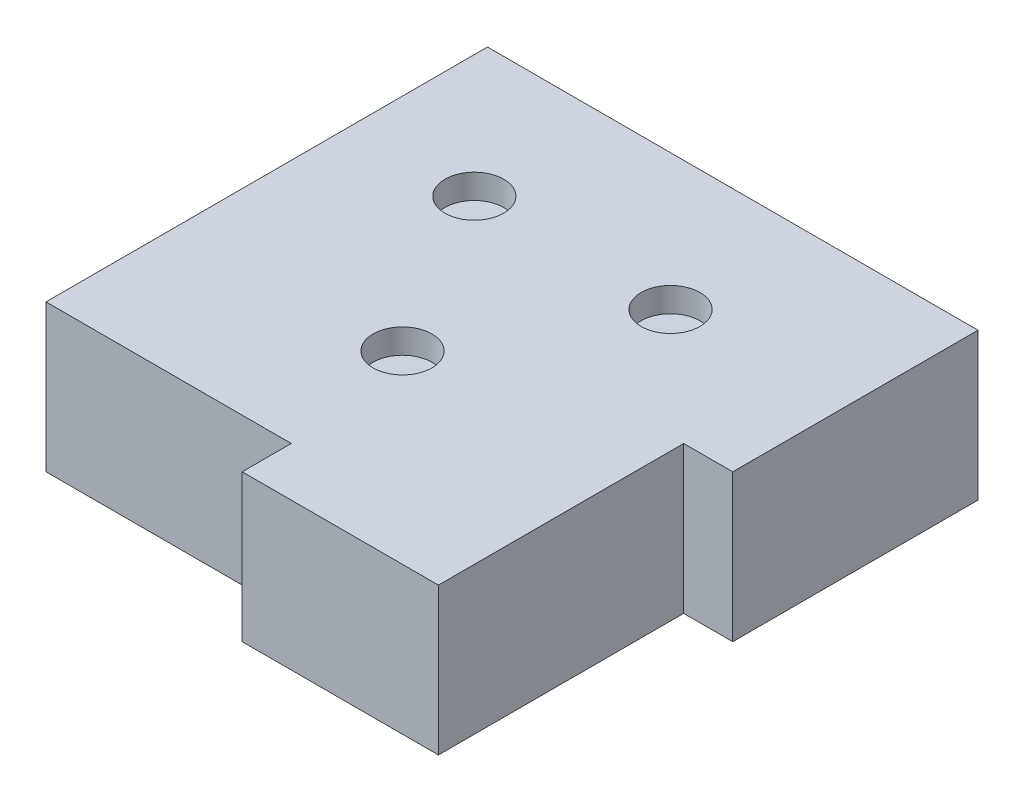
ISO-10303-21;
HEADER;
FILE_DESCRIPTION(('STEP AP214'),'2;1');
FILE_NAME('part.step','',(''),(''),'','','');
FILE_SCHEMA(('AUTOMOTIVE_DESIGN { 1 0 10303 214 1 1 1 1 }'));
ENDSEC;
DATA;
#1=APPLICATION_CONTEXT('core data for automotive mechanical design processes');
#2=APPLICATION_PROTOCOL_DEFINITION('international standard','automotive_design',2000,#1);
#3=PRODUCT_CONTEXT('',#1,'mechanical');
#4=PRODUCT('Part','Part','',(#3));
#5=PRODUCT_RELATED_PRODUCT_CATEGORY('part','',(#4));
#6=PRODUCT_DEFINITION_FORMATION('','',#4);
#7=PRODUCT_DEFINITION_CONTEXT('part definition',#1,'design');
#8=PRODUCT_DEFINITION('design','',#6,#7);
#9=PRODUCT_DEFINITION_SHAPE('','',#8);
#10=(LENGTH_UNIT() NAMED_UNIT(*) SI_UNIT(.MILLI.,.METRE.));
#11=(NAMED_UNIT(*) PLANE_ANGLE_UNIT() SI_UNIT($,.RADIAN.));
#12=(NAMED_UNIT(*) SI_UNIT($,.STERADIAN.) SOLID_ANGLE_UNIT());
#13=UNCERTAINTY_MEASURE_WITH_UNIT(LENGTH_MEASURE(1.E-05),#10,'distance_accuracy_value','');
#14=(GEOMETRIC_REPRESENTATION_CONTEXT(3) GLOBAL_UNCERTAINTY_ASSIGNED_CONTEXT((#13)) GLOBAL_UNIT_ASSIGNED_CONTEXT((#10,
#11,#12)) REPRESENTATION_CONTEXT('',''));
#15=CARTESIAN_POINT('',(0.,0.,0.));
#16=DIRECTION('',(0.,0.,1.));
#17=DIRECTION('',(1.,0.,0.));
#18=AXIS2_PLACEMENT_3D('',#15,#16,#17);
#19=CARTESIAN_POINT('',(100.,30.,-50.));
#20=DIRECTION('',(-1.,0.,0.));
#21=DIRECTION('',(0.,0.,1.));
#22=AXIS2_PLACEMENT_3D('',#19,#20,#21);
#23=PLANE('',#22);
#24=DIRECTION('',(0.,0.,-1.));
#25=VECTOR('',#24,1.);
#26=CARTESIAN_POINT('',(100.,0.,-50.));
#27=LINE('',#26,#25);
#28=CARTESIAN_POINT('',(100.,0.,-50.));
#29=VERTEX_POINT('',#28);
#30=CARTESIAN_POINT('',(100.,0.,-100.));
#31=VERTEX_POINT('',#30);
#32=EDGE_CURVE('E144',#29,#31,#27,.T.);
#33=ORIENTED_EDGE('',*,*,#32,.T.);
#34=DIRECTION('',(0.,-1.,0.));
#35=VECTOR('',#34,1.);
#36=CARTESIAN_POINT('',(100.,30.,-100.));
#37=LINE('',#36,#35);
#38=CARTESIAN_POINT('',(100.,30.,-100.));
#39=VERTEX_POINT('',#38);
#40=EDGE_CURVE('E11',#39,#31,#37,.T.);
#41=ORIENTED_EDGE('',*,*,#40,.F.);
#42=DIRECTION('',(0.,0.,-1.));
#43=VECTOR('',#42,1.);
#44=CARTESIAN_POINT('',(100.,30.,-50.));
#45=LINE('',#44,#43);
#46=CARTESIAN_POINT('',(100.,30.,-50.));
#47=VERTEX_POINT('',#46);
#48=EDGE_CURVE('E167',#47,#39,#45,.T.);
#49=ORIENTED_EDGE('',*,*,#48,.F.);
#50=DIRECTION('',(0.,-1.,0.));
#51=VECTOR('',#50,1.);
#52=CARTESIAN_POINT('',(100.,30.,-50.));
#53=LINE('',#52,#51);
#54=EDGE_CURVE('E140',#47,#29,#53,.T.);
#55=ORIENTED_EDGE('',*,*,#54,.T.);
#56=EDGE_LOOP('',(#33,#41,#49,#55));
#57=FACE_BOUND('',#56,.T.);
#58=ADVANCED_FACE('F43',(#57),#23,.F.);
#59=CARTESIAN_POINT('',(0.,30.,-100.));
#60=DIRECTION('',(0.,0.,1.));
#61=DIRECTION('',(1.,0.,0.));
#62=AXIS2_PLACEMENT_3D('',#59,#60,#61);
#63=PLANE('',#62);
#64=DIRECTION('',(-1.,0.,0.));
#65=VECTOR('',#64,1.);
#66=CARTESIAN_POINT('',(0.,0.,-100.));
#67=LINE('',#66,#65);
#68=CARTESIAN_POINT('',(0.,0.,-100.));
#69=VERTEX_POINT('',#68);
#70=EDGE_CURVE('E148',#31,#69,#67,.T.);
#71=ORIENTED_EDGE('',*,*,#70,.T.);
#72=DIRECTION('',(0.,-1.,0.));
#73=VECTOR('',#72,1.);
#74=CARTESIAN_POINT('',(0.,30.,-100.));
#75=LINE('',#74,#73);
#76=CARTESIAN_POINT('',(0.,30.,-100.));
#77=VERTEX_POINT('',#76);
#78=EDGE_CURVE('E52',#77,#69,#75,.T.);
#79=ORIENTED_EDGE('',*,*,#78,.F.);
#80=DIRECTION('',(-1.,0.,0.));
#81=VECTOR('',#80,1.);
#82=CARTESIAN_POINT('',(0.,30.,-100.));
#83=LINE('',#82,#81);
#84=EDGE_CURVE('E103',#39,#77,#83,.T.);
#85=ORIENTED_EDGE('',*,*,#84,.F.);
#86=ORIENTED_EDGE('',*,*,#40,.T.);
#87=EDGE_LOOP('',(#71,#79,#85,#86));
#88=FACE_BOUND('',#87,.T.);
#89=ADVANCED_FACE('F268',(#88),#63,.F.);
#90=CARTESIAN_POINT('',(0.,30.,-10.));
#91=DIRECTION('',(1.,0.,0.));
#92=DIRECTION('',(0.,0.,-1.));
#93=AXIS2_PLACEMENT_3D('',#90,#91,#92);
#94=PLANE('',#93);
#95=DIRECTION('',(0.,0.,1.));
#96=VECTOR('',#95,1.);
#97=CARTESIAN_POINT('',(0.,0.,-10.));
#98=LINE('',#97,#96);
#99=CARTESIAN_POINT('',(0.,0.,-10.));
#100=VERTEX_POINT('',#99);
#101=EDGE_CURVE('E152',#69,#100,#98,.T.);
#102=ORIENTED_EDGE('',*,*,#101,.T.);
#103=DIRECTION('',(0.,-1.,0.));
#104=VECTOR('',#103,1.);
#105=CARTESIAN_POINT('',(0.,30.,-10.));
#106=LINE('',#105,#104);
#107=CARTESIAN_POINT('',(0.,30.,-10.));
#108=VERTEX_POINT('',#107);
#109=EDGE_CURVE('E178',#108,#100,#106,.T.);
#110=ORIENTED_EDGE('',*,*,#109,.F.);
#111=DIRECTION('',(0.,0.,1.));
#112=VECTOR('',#111,1.);
#113=CARTESIAN_POINT('',(0.,30.,-10.));
#114=LINE('',#113,#112);
#115=EDGE_CURVE('E188',#77,#108,#114,.T.);
#116=ORIENTED_EDGE('',*,*,#115,.F.);
#117=ORIENTED_EDGE('',*,*,#78,.T.);
#118=EDGE_LOOP('',(#102,#110,#116,#117));
#119=FACE_BOUND('',#118,.T.);
#120=ADVANCED_FACE('F186',(#119),#94,.F.);
#121=CARTESIAN_POINT('',(0.,30.,-10.));
#122=DIRECTION('',(0.,0.,-1.));
#123=DIRECTION('',(-1.,0.,0.));
#124=AXIS2_PLACEMENT_3D('',#121,#122,#123);
#125=PLANE('',#124);
#126=DIRECTION('',(1.,0.,0.));
#127=VECTOR('',#126,1.);
#128=CARTESIAN_POINT('',(0.,0.,-10.));
#129=LINE('',#128,#127);
#130=CARTESIAN_POINT('',(50.,0.,-10.));
#131=VERTEX_POINT('',#130);
#132=EDGE_CURVE('E155',#100,#131,#129,.T.);
#133=ORIENTED_EDGE('',*,*,#132,.T.);
#134=DIRECTION('',(0.,-1.,0.));
#135=VECTOR('',#134,1.);
#136=CARTESIAN_POINT('',(50.,30.,-10.));
#137=LINE('',#136,#135);
#138=CARTESIAN_POINT('',(50.,30.,-10.));
#139=VERTEX_POINT('',#138);
#140=EDGE_CURVE('E174',#139,#131,#137,.T.);
#141=ORIENTED_EDGE('',*,*,#140,.F.);
#142=DIRECTION('',(1.,0.,0.));
#143=VECTOR('',#142,1.);
#144=CARTESIAN_POINT('',(0.,30.,-10.));
#145=LINE('',#144,#143);
#146=EDGE_CURVE('E201',#108,#139,#145,.T.);
#147=ORIENTED_EDGE('',*,*,#146,.F.);
#148=ORIENTED_EDGE('',*,*,#109,.T.);
#149=EDGE_LOOP('',(#133,#141,#147,#148));
#150=FACE_BOUND('',#149,.T.);
#151=ADVANCED_FACE('F196',(#150),#125,.F.);
#152=CARTESIAN_POINT('',(50.,30.,-10.));
#153=DIRECTION('',(1.,0.,0.));
#154=DIRECTION('',(0.,0.,-1.));
#155=AXIS2_PLACEMENT_3D('',#152,#153,#154);
#156=PLANE('',#155);
#157=DIRECTION('',(0.,0.,1.));
#158=VECTOR('',#157,1.);
#159=CARTESIAN_POINT('',(50.,0.,-10.));
#160=LINE('',#159,#158);
#161=CARTESIAN_POINT('',(50.,0.,0.));
#162=VERTEX_POINT('',#161);
#163=EDGE_CURVE('E158',#131,#162,#160,.T.);
#164=ORIENTED_EDGE('',*,*,#163,.T.);
#165=DIRECTION('',(0.,-1.,0.));
#166=VECTOR('',#165,1.);
#167=CARTESIAN_POINT('',(50.,30.,0.));
#168=LINE('',#167,#166);
#169=CARTESIAN_POINT('',(50.,30.,0.));
#170=VERTEX_POINT('',#169);
#171=EDGE_CURVE('E133',#170,#162,#168,.T.);
#172=ORIENTED_EDGE('',*,*,#171,.F.);
#173=DIRECTION('',(0.,0.,1.));
#174=VECTOR('',#173,1.);
#175=CARTESIAN_POINT('',(50.,30.,-10.));
#176=LINE('',#175,#174);
#177=EDGE_CURVE('E122',#139,#170,#176,.T.);
#178=ORIENTED_EDGE('',*,*,#177,.F.);
#179=ORIENTED_EDGE('',*,*,#140,.T.);
#180=EDGE_LOOP('',(#164,#172,#178,#179));
#181=FACE_BOUND('',#180,.T.);
#182=ADVANCED_FACE('F199',(#181),#156,.F.);
#183=CARTESIAN_POINT('',(50.,30.,0.));
#184=DIRECTION('',(0.,0.,-1.));
#185=DIRECTION('',(-1.,0.,0.));
#186=AXIS2_PLACEMENT_3D('',#183,#184,#185);
#187=PLANE('',#186);
#188=DIRECTION('',(1.,0.,0.));
#189=VECTOR('',#188,1.);
#190=CARTESIAN_POINT('',(50.,0.,0.));
#191=LINE('',#190,#189);
#192=CARTESIAN_POINT('',(90.,0.,0.));
#193=VERTEX_POINT('',#192);
#194=EDGE_CURVE('E131',#162,#193,#191,.T.);
#195=ORIENTED_EDGE('',*,*,#194,.T.);
#196=DIRECTION('',(0.,-1.,0.));
#197=VECTOR('',#196,1.);
#198=CARTESIAN_POINT('',(90.,30.,0.));
#199=LINE('',#198,#197);
#200=CARTESIAN_POINT('',(90.,30.,0.));
#201=VERTEX_POINT('',#200);
#202=EDGE_CURVE('E128',#201,#193,#199,.T.);
#203=ORIENTED_EDGE('',*,*,#202,.F.);
#204=DIRECTION('',(1.,0.,0.));
#205=VECTOR('',#204,1.);
#206=CARTESIAN_POINT('',(50.,30.,0.));
#207=LINE('',#206,#205);
#208=EDGE_CURVE('E116',#170,#201,#207,.T.);
#209=ORIENTED_EDGE('',*,*,#208,.F.);
#210=ORIENTED_EDGE('',*,*,#171,.T.);
#211=EDGE_LOOP('',(#195,#203,#209,#210));
#212=FACE_BOUND('',#211,.T.);
#213=ADVANCED_FACE('F129',(#212),#187,.F.);
#214=CARTESIAN_POINT('',(90.,30.,0.));
#215=DIRECTION('',(-1.,0.,0.));
#216=DIRECTION('',(0.,0.,1.));
#217=AXIS2_PLACEMENT_3D('',#214,#215,#216);
#218=PLANE('',#217);
#219=DIRECTION('',(0.,0.,-1.));
#220=VECTOR('',#219,1.);
#221=CARTESIAN_POINT('',(90.,0.,0.));
#222=LINE('',#221,#220);
#223=CARTESIAN_POINT('',(90.,0.,-50.));
#224=VERTEX_POINT('',#223);
#225=EDGE_CURVE('E89',#193,#224,#222,.T.);
#226=ORIENTED_EDGE('',*,*,#225,.T.);
#227=DIRECTION('',(0.,-1.,0.));
#228=VECTOR('',#227,1.);
#229=CARTESIAN_POINT('',(90.,30.,-50.));
#230=LINE('',#229,#228);
#231=CARTESIAN_POINT('',(90.,30.,-50.));
#232=VERTEX_POINT('',#231);
#233=EDGE_CURVE('E134',#232,#224,#230,.T.);
#234=ORIENTED_EDGE('',*,*,#233,.F.);
#235=DIRECTION('',(0.,0.,-1.));
#236=VECTOR('',#235,1.);
#237=CARTESIAN_POINT('',(90.,30.,0.));
#238=LINE('',#237,#236);
#239=EDGE_CURVE('E120',#201,#232,#238,.T.);
#240=ORIENTED_EDGE('',*,*,#239,.F.);
#241=ORIENTED_EDGE('',*,*,#202,.T.);
#242=EDGE_LOOP('',(#226,#234,#240,#241));
#243=FACE_BOUND('',#242,.T.);
#244=ADVANCED_FACE('F136',(#243),#218,.F.);
#245=CARTESIAN_POINT('',(90.,30.,-50.));
#246=DIRECTION('',(0.,0.,-1.));
#247=DIRECTION('',(-1.,0.,0.));
#248=AXIS2_PLACEMENT_3D('',#245,#246,#247);
#249=PLANE('',#248);
#250=DIRECTION('',(1.,0.,0.));
#251=VECTOR('',#250,1.);
#252=CARTESIAN_POINT('',(90.,0.,-50.));
#253=LINE('',#252,#251);
#254=EDGE_CURVE('E95',#224,#29,#253,.T.);
#255=ORIENTED_EDGE('',*,*,#254,.T.);
#256=ORIENTED_EDGE('',*,*,#54,.F.);
#257=DIRECTION('',(1.,0.,0.));
#258=VECTOR('',#257,1.);
#259=CARTESIAN_POINT('',(90.,30.,-50.));
#260=LINE('',#259,#258);
#261=EDGE_CURVE('E60',#232,#47,#260,.T.);
#262=ORIENTED_EDGE('',*,*,#261,.F.);
#263=ORIENTED_EDGE('',*,*,#233,.T.);
#264=EDGE_LOOP('',(#255,#256,#262,#263));
#265=FACE_BOUND('',#264,.T.);
#266=ADVANCED_FACE('F246',(#265),#249,.F.);
#267=CARTESIAN_POINT('',(0.,30.,0.));
#268=DIRECTION('',(0.,-1.,0.));
#269=DIRECTION('',(0.,0.,-1.));
#270=AXIS2_PLACEMENT_3D('',#267,#268,#269);
#271=PLANE('',#270);
#272=CARTESIAN_POINT('',(25.,30.,-72.32));
#273=DIRECTION('',(0.,1.,0.));
#274=DIRECTION('',(0.,0.,1.));
#275=AXIS2_PLACEMENT_3D('',#272,#273,#274);
#276=CIRCLE('',#275,6.);
#277=CARTESIAN_POINT('',(25.,30.,-66.32));
#278=VERTEX_POINT('',#277);
#279=EDGE_CURVE('E227',#278,#278,#276,.T.);
#280=ORIENTED_EDGE('',*,*,#279,.F.);
#281=EDGE_LOOP('',(#280));
#282=FACE_BOUND('',#281,.T.);
#283=CARTESIAN_POINT('',(65.,30.,-72.32));
#284=DIRECTION('',(0.,1.,0.));
#285=DIRECTION('',(0.,0.,1.));
#286=AXIS2_PLACEMENT_3D('',#283,#284,#285);
#287=CIRCLE('',#286,6.);
#288=CARTESIAN_POINT('',(65.,30.,-66.32));
#289=VERTEX_POINT('',#288);
#290=EDGE_CURVE('E223',#289,#289,#287,.T.);
#291=ORIENTED_EDGE('',*,*,#290,.F.);
#292=EDGE_LOOP('',(#291));
#293=FACE_BOUND('',#292,.T.);
#294=CARTESIAN_POINT('',(45.,30.,-37.68));
#295=DIRECTION('',(0.,1.,0.));
#296=DIRECTION('',(0.,0.,1.));
#297=AXIS2_PLACEMENT_3D('',#294,#295,#296);
#298=CIRCLE('',#297,6.);
#299=CARTESIAN_POINT('',(45.,30.,-31.68));
#300=VERTEX_POINT('',#299);
#301=EDGE_CURVE('E215',#300,#300,#298,.T.);
#302=ORIENTED_EDGE('',*,*,#301,.F.);
#303=EDGE_LOOP('',(#302));
#304=FACE_BOUND('',#303,.T.);
#305=ORIENTED_EDGE('',*,*,#48,.T.);
#306=ORIENTED_EDGE('',*,*,#84,.T.);
#307=ORIENTED_EDGE('',*,*,#115,.T.);
#308=ORIENTED_EDGE('',*,*,#146,.T.);
#309=ORIENTED_EDGE('',*,*,#177,.T.);
#310=ORIENTED_EDGE('',*,*,#208,.T.);
#311=ORIENTED_EDGE('',*,*,#239,.T.);
#312=ORIENTED_EDGE('',*,*,#261,.T.);
#313=EDGE_LOOP('',(#305,#306,#307,#308,#309,#310,#311,#312));
#314=FACE_BOUND('',#313,.T.);
#315=ADVANCED_FACE('F118',(#282,#293,#304,#314),#271,.F.);
#316=CARTESIAN_POINT('',(0.,0.,0.));
#317=DIRECTION('',(0.,-1.,0.));
#318=DIRECTION('',(0.,0.,-1.));
#319=AXIS2_PLACEMENT_3D('',#316,#317,#318);
#320=PLANE('',#319);
#321=ORIENTED_EDGE('',*,*,#32,.F.);
#322=ORIENTED_EDGE('',*,*,#254,.F.);
#323=ORIENTED_EDGE('',*,*,#225,.F.);
#324=ORIENTED_EDGE('',*,*,#194,.F.);
#325=ORIENTED_EDGE('',*,*,#163,.F.);
#326=ORIENTED_EDGE('',*,*,#132,.F.);
#327=ORIENTED_EDGE('',*,*,#101,.F.);
#328=ORIENTED_EDGE('',*,*,#70,.F.);
#329=EDGE_LOOP('',(#321,#322,#323,#324,#325,#326,#327,#328));
#330=FACE_BOUND('',#329,.T.);
#331=ADVANCED_FACE('F192',(#330),#320,.T.);
#332=CARTESIAN_POINT('',(45.,25.,-37.68));
#333=DIRECTION('',(0.,1.,0.));
#334=DIRECTION('',(0.,0.,1.));
#335=AXIS2_PLACEMENT_3D('',#332,#333,#334);
#336=CYLINDRICAL_SURFACE('',#335,6.);
#337=CARTESIAN_POINT('',(45.,25.,-37.68));
#338=DIRECTION('',(0.,1.,0.));
#339=DIRECTION('',(0.,0.,1.));
#340=AXIS2_PLACEMENT_3D('',#337,#338,#339);
#341=CIRCLE('',#340,6.);
#342=CARTESIAN_POINT('',(45.,25.,-31.68));
#343=VERTEX_POINT('',#342);
#344=EDGE_CURVE('E211',#343,#343,#341,.T.);
#345=ORIENTED_EDGE('',*,*,#344,.F.);
#346=EDGE_LOOP('',(#345));
#347=FACE_BOUND('',#346,.T.);
#348=ORIENTED_EDGE('',*,*,#301,.T.);
#349=EDGE_LOOP('',(#348));
#350=FACE_BOUND('',#349,.T.);
#351=ADVANCED_FACE('F252',(#347,#350),#336,.F.);
#352=CARTESIAN_POINT('',(45.,25.,-37.68));
#353=DIRECTION('',(0.,1.,0.));
#354=DIRECTION('',(0.,0.,1.));
#355=AXIS2_PLACEMENT_3D('',#352,#353,#354);
#356=PLANE('',#355);
#357=ORIENTED_EDGE('',*,*,#344,.T.);
#358=EDGE_LOOP('',(#357));
#359=FACE_BOUND('',#358,.T.);
#360=ADVANCED_FACE('F254',(#359),#356,.T.);
#361=CARTESIAN_POINT('',(65.,25.,-72.32));
#362=DIRECTION('',(0.,1.,0.));
#363=DIRECTION('',(0.,0.,1.));
#364=AXIS2_PLACEMENT_3D('',#361,#362,#363);
#365=CYLINDRICAL_SURFACE('',#364,6.);
#366=CARTESIAN_POINT('',(65.,25.,-72.32));
#367=DIRECTION('',(0.,1.,0.));
#368=DIRECTION('',(0.,0.,1.));
#369=AXIS2_PLACEMENT_3D('',#366,#367,#368);
#370=CIRCLE('',#369,6.);
#371=CARTESIAN_POINT('',(65.,25.,-66.32));
#372=VERTEX_POINT('',#371);
#373=EDGE_CURVE('E219',#372,#372,#370,.T.);
#374=ORIENTED_EDGE('',*,*,#373,.F.);
#375=EDGE_LOOP('',(#374));
#376=FACE_BOUND('',#375,.T.);
#377=ORIENTED_EDGE('',*,*,#290,.T.);
#378=EDGE_LOOP('',(#377));
#379=FACE_BOUND('',#378,.T.);
#380=ADVANCED_FACE('F261',(#376,#379),#365,.F.);
#381=CARTESIAN_POINT('',(65.,25.,-72.32));
#382=DIRECTION('',(0.,1.,0.));
#383=DIRECTION('',(0.,0.,1.));
#384=AXIS2_PLACEMENT_3D('',#381,#382,#383);
#385=PLANE('',#384);
#386=ORIENTED_EDGE('',*,*,#373,.T.);
#387=EDGE_LOOP('',(#386));
#388=FACE_BOUND('',#387,.T.);
#389=ADVANCED_FACE('F240',(#388),#385,.T.);
#390=CARTESIAN_POINT('',(25.,25.,-72.32));
#391=DIRECTION('',(0.,1.,0.));
#392=DIRECTION('',(0.,0.,1.));
#393=AXIS2_PLACEMENT_3D('',#390,#391,#392);
#394=CYLINDRICAL_SURFACE('',#393,6.);
#395=CARTESIAN_POINT('',(25.,25.,-72.32));
#396=DIRECTION('',(0.,1.,0.));
#397=DIRECTION('',(0.,0.,1.));
#398=AXIS2_PLACEMENT_3D('',#395,#396,#397);
#399=CIRCLE('',#398,6.);
#400=CARTESIAN_POINT('',(25.,25.,-66.32));
#401=VERTEX_POINT('',#400);
#402=EDGE_CURVE('E149',#401,#401,#399,.T.);
#403=ORIENTED_EDGE('',*,*,#402,.F.);
#404=EDGE_LOOP('',(#403));
#405=FACE_BOUND('',#404,.T.);
#406=ORIENTED_EDGE('',*,*,#279,.T.);
#407=EDGE_LOOP('',(#406));
#408=FACE_BOUND('',#407,.T.);
#409=ADVANCED_FACE('F237',(#405,#408),#394,.F.);
#410=CARTESIAN_POINT('',(25.,25.,-72.32));
#411=DIRECTION('',(0.,1.,0.));
#412=DIRECTION('',(0.,0.,1.));
#413=AXIS2_PLACEMENT_3D('',#410,#411,#412);
#414=PLANE('',#413);
#415=ORIENTED_EDGE('',*,*,#402,.T.);
#416=EDGE_LOOP('',(#415));
#417=FACE_BOUND('',#416,.T.);
#418=ADVANCED_FACE('F235',(#417),#414,.T.);
#419=CLOSED_SHELL('',(#58,#89,#120,#151,#182,#213,#244,#266,#315,#331,#351,#360,#380,#389,#409,#418));
#420=MANIFOLD_SOLID_BREP('B2',#419);
#421=ADVANCED_BREP_SHAPE_REPRESENTATION('',(#18,#420),#14);
#422=SHAPE_DEFINITION_REPRESENTATION(#9,#421);
ENDSEC;
END-ISO-10303-21;
